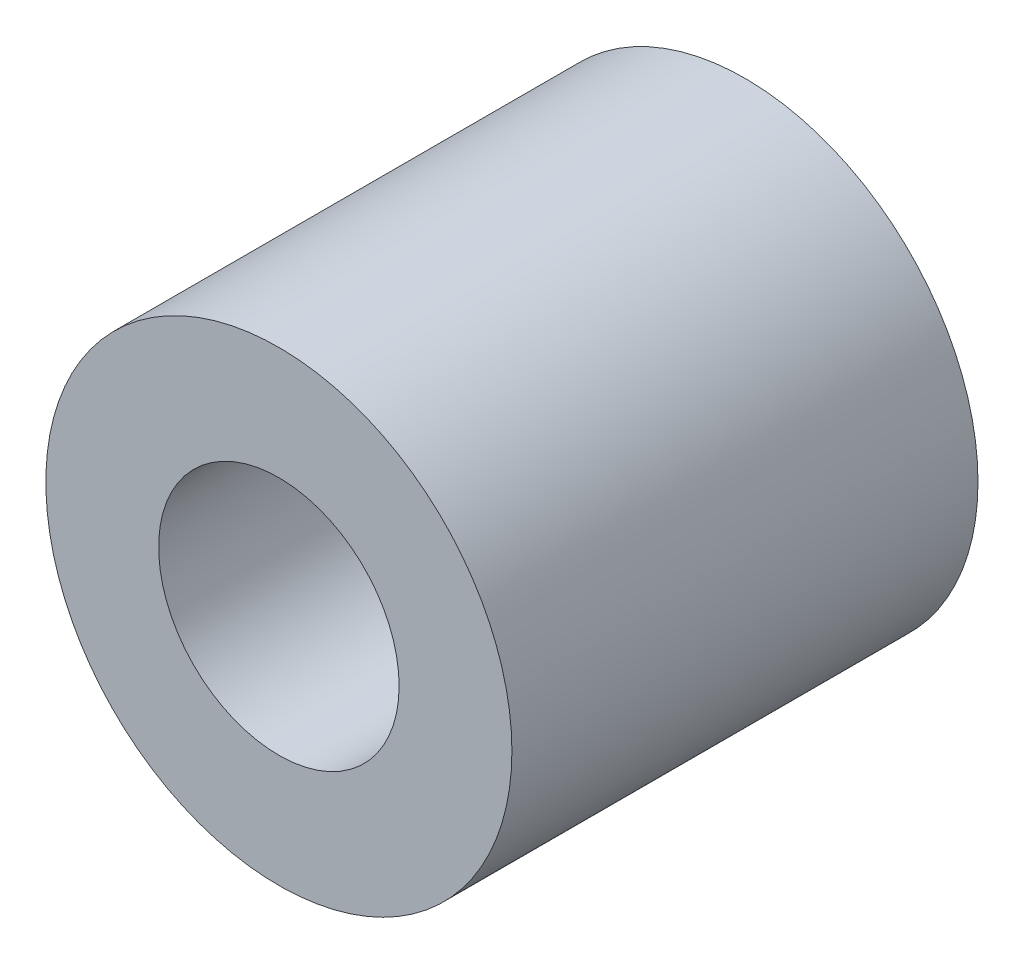
ISO-10303-21;
HEADER;
FILE_DESCRIPTION(('STEP AP214'),'2;1');
FILE_NAME('part.step','',(''),(''),'','','');
FILE_SCHEMA(('AUTOMOTIVE_DESIGN { 1 0 10303 214 1 1 1 1 }'));
ENDSEC;
DATA;
#1=APPLICATION_CONTEXT('core data for automotive mechanical design processes');
#2=APPLICATION_PROTOCOL_DEFINITION('international standard','automotive_design',2000,#1);
#3=PRODUCT_CONTEXT('',#1,'mechanical');
#4=PRODUCT('Part','Part','',(#3));
#5=PRODUCT_RELATED_PRODUCT_CATEGORY('part','',(#4));
#6=PRODUCT_DEFINITION_FORMATION('','',#4);
#7=PRODUCT_DEFINITION_CONTEXT('part definition',#1,'design');
#8=PRODUCT_DEFINITION('design','',#6,#7);
#9=PRODUCT_DEFINITION_SHAPE('','',#8);
#10=(LENGTH_UNIT() NAMED_UNIT(*) SI_UNIT(.MILLI.,.METRE.));
#11=(NAMED_UNIT(*) PLANE_ANGLE_UNIT() SI_UNIT($,.RADIAN.));
#12=(NAMED_UNIT(*) SI_UNIT($,.STERADIAN.) SOLID_ANGLE_UNIT());
#13=UNCERTAINTY_MEASURE_WITH_UNIT(LENGTH_MEASURE(1.E-05),#10,'distance_accuracy_value','');
#14=(GEOMETRIC_REPRESENTATION_CONTEXT(3) GLOBAL_UNCERTAINTY_ASSIGNED_CONTEXT((#13)) GLOBAL_UNIT_ASSIGNED_CONTEXT((#10,
#11,#12)) REPRESENTATION_CONTEXT('',''));
#15=CARTESIAN_POINT('',(0.,0.,0.));
#16=DIRECTION('',(0.,0.,1.));
#17=DIRECTION('',(1.,0.,0.));
#18=AXIS2_PLACEMENT_3D('',#15,#16,#17);
#19=CARTESIAN_POINT('',(0.,0.,3.175));
#20=DIRECTION('',(0.,0.,1.));
#21=DIRECTION('',(1.,0.,0.));
#22=AXIS2_PLACEMENT_3D('',#19,#20,#21);
#23=PLANE('',#22);
#24=CARTESIAN_POINT('',(0.,0.,3.175));
#25=DIRECTION('',(0.,0.,1.));
#26=DIRECTION('',(1.,0.,0.));
#27=AXIS2_PLACEMENT_3D('',#24,#25,#26);
#28=CIRCLE('',#27,3.175);
#29=CARTESIAN_POINT('',(3.175,0.,3.175));
#30=VERTEX_POINT('',#29);
#31=EDGE_CURVE('E10',#30,#30,#28,.T.);
#32=ORIENTED_EDGE('',*,*,#31,.T.);
#33=EDGE_LOOP('',(#32));
#34=FACE_BOUND('',#33,.T.);
#35=CARTESIAN_POINT('',(0.,0.,3.175));
#36=DIRECTION('',(0.,0.,1.));
#37=DIRECTION('',(1.,0.,0.));
#38=AXIS2_PLACEMENT_3D('',#35,#36,#37);
#39=CIRCLE('',#38,1.6383);
#40=CARTESIAN_POINT('',(1.6383,0.,3.175));
#41=VERTEX_POINT('',#40);
#42=EDGE_CURVE('E41',#41,#41,#39,.T.);
#43=ORIENTED_EDGE('',*,*,#42,.F.);
#44=EDGE_LOOP('',(#43));
#45=FACE_BOUND('',#44,.T.);
#46=ADVANCED_FACE('F30',(#34,#45),#23,.T.);
#47=CARTESIAN_POINT('',(0.,0.,-3.175));
#48=DIRECTION('',(0.,0.,1.));
#49=DIRECTION('',(1.,0.,0.));
#50=AXIS2_PLACEMENT_3D('',#47,#48,#49);
#51=PLANE('',#50);
#52=CARTESIAN_POINT('',(0.,0.,-3.175));
#53=DIRECTION('',(0.,0.,1.));
#54=DIRECTION('',(1.,0.,0.));
#55=AXIS2_PLACEMENT_3D('',#52,#53,#54);
#56=CIRCLE('',#55,3.175);
#57=CARTESIAN_POINT('',(3.175,0.,-3.175));
#58=VERTEX_POINT('',#57);
#59=EDGE_CURVE('E34',#58,#58,#56,.T.);
#60=ORIENTED_EDGE('',*,*,#59,.F.);
#61=EDGE_LOOP('',(#60));
#62=FACE_BOUND('',#61,.T.);
#63=CARTESIAN_POINT('',(0.,0.,-3.175));
#64=DIRECTION('',(0.,0.,1.));
#65=DIRECTION('',(1.,0.,0.));
#66=AXIS2_PLACEMENT_3D('',#63,#64,#65);
#67=CIRCLE('',#66,1.6383);
#68=CARTESIAN_POINT('',(1.6383,0.,-3.175));
#69=VERTEX_POINT('',#68);
#70=EDGE_CURVE('E43',#69,#69,#67,.T.);
#71=ORIENTED_EDGE('',*,*,#70,.T.);
#72=EDGE_LOOP('',(#71));
#73=FACE_BOUND('',#72,.T.);
#74=ADVANCED_FACE('F53',(#62,#73),#51,.F.);
#75=CARTESIAN_POINT('',(0.,0.,3.175));
#76=DIRECTION('',(0.,0.,-1.));
#77=DIRECTION('',(-1.,0.,0.));
#78=AXIS2_PLACEMENT_3D('',#75,#76,#77);
#79=CYLINDRICAL_SURFACE('',#78,3.175);
#80=ORIENTED_EDGE('',*,*,#31,.F.);
#81=EDGE_LOOP('',(#80));
#82=FACE_BOUND('',#81,.T.);
#83=ORIENTED_EDGE('',*,*,#59,.T.);
#84=EDGE_LOOP('',(#83));
#85=FACE_BOUND('',#84,.T.);
#86=ADVANCED_FACE('F32',(#82,#85),#79,.T.);
#87=CARTESIAN_POINT('',(0.,0.,3.175));
#88=DIRECTION('',(0.,0.,-1.));
#89=DIRECTION('',(-1.,0.,0.));
#90=AXIS2_PLACEMENT_3D('',#87,#88,#89);
#91=CYLINDRICAL_SURFACE('',#90,1.6383);
#92=ORIENTED_EDGE('',*,*,#42,.T.);
#93=EDGE_LOOP('',(#92));
#94=FACE_BOUND('',#93,.T.);
#95=ORIENTED_EDGE('',*,*,#70,.F.);
#96=EDGE_LOOP('',(#95));
#97=FACE_BOUND('',#96,.T.);
#98=ADVANCED_FACE('F49',(#94,#97),#91,.F.);
#99=CLOSED_SHELL('',(#46,#74,#86,#98));
#100=MANIFOLD_SOLID_BREP('B2',#99);
#101=ADVANCED_BREP_SHAPE_REPRESENTATION('',(#18,#100),#14);
#102=SHAPE_DEFINITION_REPRESENTATION(#9,#101);
ENDSEC;
END-ISO-10303-21;
